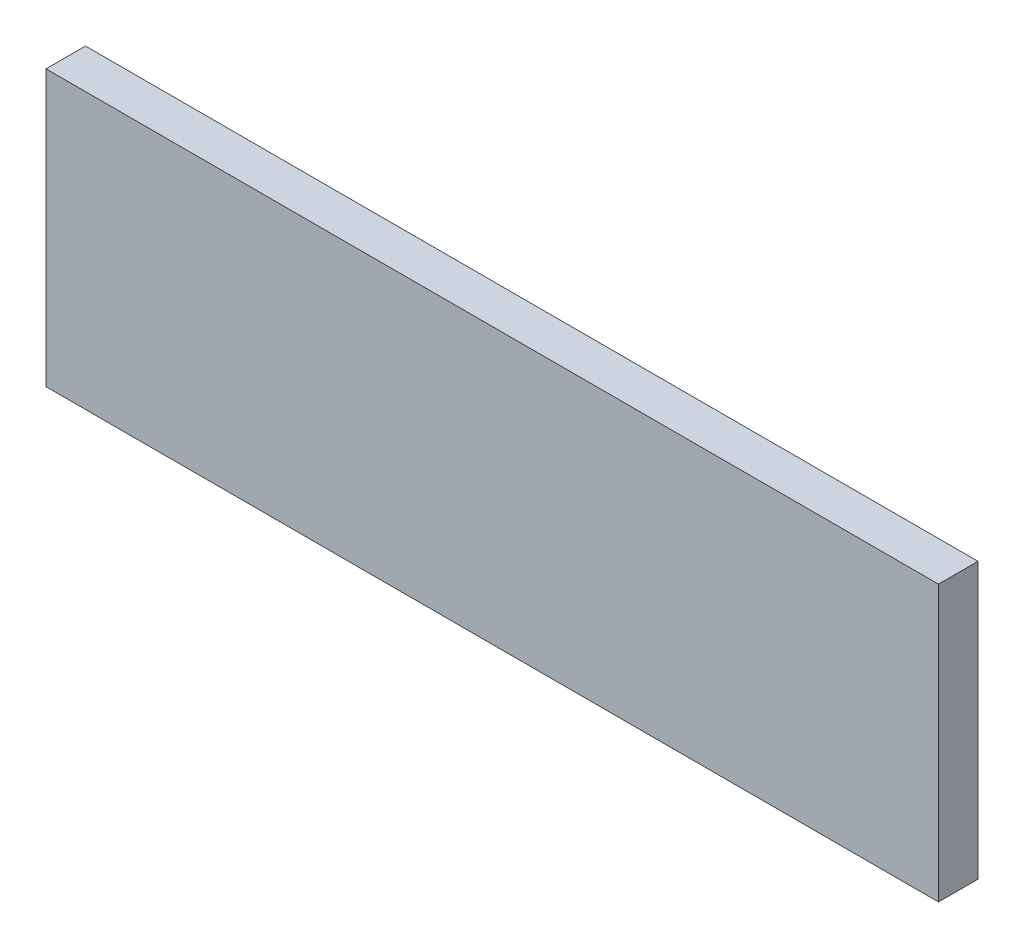
ISO-10303-21;
HEADER;
FILE_DESCRIPTION(('STEP AP214'),'2;1');
FILE_NAME('part.step','',(''),(''),'','','');
FILE_SCHEMA(('AUTOMOTIVE_DESIGN { 1 0 10303 214 1 1 1 1 }'));
ENDSEC;
DATA;
#1=APPLICATION_CONTEXT('core data for automotive mechanical design processes');
#2=APPLICATION_PROTOCOL_DEFINITION('international standard','automotive_design',2000,#1);
#3=PRODUCT_CONTEXT('',#1,'mechanical');
#4=PRODUCT('Part','Part','',(#3));
#5=PRODUCT_RELATED_PRODUCT_CATEGORY('part','',(#4));
#6=PRODUCT_DEFINITION_FORMATION('','',#4);
#7=PRODUCT_DEFINITION_CONTEXT('part definition',#1,'design');
#8=PRODUCT_DEFINITION('design','',#6,#7);
#9=PRODUCT_DEFINITION_SHAPE('','',#8);
#10=(LENGTH_UNIT() NAMED_UNIT(*) SI_UNIT(.MILLI.,.METRE.));
#11=(NAMED_UNIT(*) PLANE_ANGLE_UNIT() SI_UNIT($,.RADIAN.));
#12=(NAMED_UNIT(*) SI_UNIT($,.STERADIAN.) SOLID_ANGLE_UNIT());
#13=UNCERTAINTY_MEASURE_WITH_UNIT(LENGTH_MEASURE(1.E-05),#10,'distance_accuracy_value','');
#14=(GEOMETRIC_REPRESENTATION_CONTEXT(3) GLOBAL_UNCERTAINTY_ASSIGNED_CONTEXT((#13)) GLOBAL_UNIT_ASSIGNED_CONTEXT((#10,
#11,#12)) REPRESENTATION_CONTEXT('',''));
#15=CARTESIAN_POINT('',(0.,0.,0.));
#16=DIRECTION('',(0.,0.,1.));
#17=DIRECTION('',(1.,0.,0.));
#18=AXIS2_PLACEMENT_3D('',#15,#16,#17);
#19=CARTESIAN_POINT('',(137.8,42.5,12.2));
#20=DIRECTION('',(-1.,0.,0.));
#21=DIRECTION('',(0.,-1.,0.));
#22=AXIS2_PLACEMENT_3D('',#19,#20,#21);
#23=PLANE('',#22);
#24=DIRECTION('',(0.,1.,0.));
#25=VECTOR('',#24,1.);
#26=CARTESIAN_POINT('',(137.8,42.5,0.));
#27=LINE('',#26,#25);
#28=CARTESIAN_POINT('',(137.8,-42.5,0.));
#29=VERTEX_POINT('',#28);
#30=CARTESIAN_POINT('',(137.8,42.5,0.));
#31=VERTEX_POINT('',#30);
#32=EDGE_CURVE('E109',#29,#31,#27,.T.);
#33=ORIENTED_EDGE('',*,*,#32,.T.);
#34=DIRECTION('',(0.,0.,-1.));
#35=VECTOR('',#34,1.);
#36=CARTESIAN_POINT('',(137.8,42.5,12.2));
#37=LINE('',#36,#35);
#38=CARTESIAN_POINT('',(137.8,42.5,12.2));
#39=VERTEX_POINT('',#38);
#40=EDGE_CURVE('E11',#39,#31,#37,.T.);
#41=ORIENTED_EDGE('',*,*,#40,.F.);
#42=DIRECTION('',(0.,1.,0.));
#43=VECTOR('',#42,1.);
#44=CARTESIAN_POINT('',(137.8,42.5,12.2));
#45=LINE('',#44,#43);
#46=CARTESIAN_POINT('',(137.8,-42.5,12.2));
#47=VERTEX_POINT('',#46);
#48=EDGE_CURVE('E93',#47,#39,#45,.T.);
#49=ORIENTED_EDGE('',*,*,#48,.F.);
#50=DIRECTION('',(0.,0.,-1.));
#51=VECTOR('',#50,1.);
#52=CARTESIAN_POINT('',(137.8,-42.5,12.2));
#53=LINE('',#52,#51);
#54=EDGE_CURVE('E105',#47,#29,#53,.T.);
#55=ORIENTED_EDGE('',*,*,#54,.T.);
#56=EDGE_LOOP('',(#33,#41,#49,#55));
#57=FACE_BOUND('',#56,.T.);
#58=ADVANCED_FACE('F41',(#57),#23,.F.);
#59=CARTESIAN_POINT('',(-137.8,42.5,12.2));
#60=DIRECTION('',(0.,-1.,0.));
#61=DIRECTION('',(0.,0.,-1.));
#62=AXIS2_PLACEMENT_3D('',#59,#60,#61);
#63=PLANE('',#62);
#64=DIRECTION('',(-1.,0.,0.));
#65=VECTOR('',#64,1.);
#66=CARTESIAN_POINT('',(-137.8,42.5,0.));
#67=LINE('',#66,#65);
#68=CARTESIAN_POINT('',(-137.8,42.5,0.));
#69=VERTEX_POINT('',#68);
#70=EDGE_CURVE('E98',#31,#69,#67,.T.);
#71=ORIENTED_EDGE('',*,*,#70,.T.);
#72=DIRECTION('',(0.,0.,-1.));
#73=VECTOR('',#72,1.);
#74=CARTESIAN_POINT('',(-137.8,42.5,12.2));
#75=LINE('',#74,#73);
#76=CARTESIAN_POINT('',(-137.8,42.5,12.2));
#77=VERTEX_POINT('',#76);
#78=EDGE_CURVE('E50',#77,#69,#75,.T.);
#79=ORIENTED_EDGE('',*,*,#78,.F.);
#80=DIRECTION('',(-1.,0.,0.));
#81=VECTOR('',#80,1.);
#82=CARTESIAN_POINT('',(-137.8,42.5,12.2));
#83=LINE('',#82,#81);
#84=EDGE_CURVE('E88',#39,#77,#83,.T.);
#85=ORIENTED_EDGE('',*,*,#84,.F.);
#86=ORIENTED_EDGE('',*,*,#40,.T.);
#87=EDGE_LOOP('',(#71,#79,#85,#86));
#88=FACE_BOUND('',#87,.T.);
#89=ADVANCED_FACE('F97',(#88),#63,.F.);
#90=CARTESIAN_POINT('',(-137.8,42.5,12.2));
#91=DIRECTION('',(1.,0.,0.));
#92=DIRECTION('',(0.,1.,0.));
#93=AXIS2_PLACEMENT_3D('',#90,#91,#92);
#94=PLANE('',#93);
#95=DIRECTION('',(0.,-1.,0.));
#96=VECTOR('',#95,1.);
#97=CARTESIAN_POINT('',(-137.8,42.5,0.));
#98=LINE('',#97,#96);
#99=CARTESIAN_POINT('',(-137.8,-42.5,0.));
#100=VERTEX_POINT('',#99);
#101=EDGE_CURVE('E75',#69,#100,#98,.T.);
#102=ORIENTED_EDGE('',*,*,#101,.T.);
#103=DIRECTION('',(0.,0.,-1.));
#104=VECTOR('',#103,1.);
#105=CARTESIAN_POINT('',(-137.8,-42.5,12.2));
#106=LINE('',#105,#104);
#107=CARTESIAN_POINT('',(-137.8,-42.5,12.2));
#108=VERTEX_POINT('',#107);
#109=EDGE_CURVE('E100',#108,#100,#106,.T.);
#110=ORIENTED_EDGE('',*,*,#109,.F.);
#111=DIRECTION('',(0.,-1.,0.));
#112=VECTOR('',#111,1.);
#113=CARTESIAN_POINT('',(-137.8,42.5,12.2));
#114=LINE('',#113,#112);
#115=EDGE_CURVE('E91',#77,#108,#114,.T.);
#116=ORIENTED_EDGE('',*,*,#115,.F.);
#117=ORIENTED_EDGE('',*,*,#78,.T.);
#118=EDGE_LOOP('',(#102,#110,#116,#117));
#119=FACE_BOUND('',#118,.T.);
#120=ADVANCED_FACE('F101',(#119),#94,.F.);
#121=CARTESIAN_POINT('',(-137.8,-42.5,12.2));
#122=DIRECTION('',(0.,1.,0.));
#123=DIRECTION('',(0.,0.,1.));
#124=AXIS2_PLACEMENT_3D('',#121,#122,#123);
#125=PLANE('',#124);
#126=DIRECTION('',(1.,0.,0.));
#127=VECTOR('',#126,1.);
#128=CARTESIAN_POINT('',(-137.8,-42.5,0.));
#129=LINE('',#128,#127);
#130=EDGE_CURVE('E81',#100,#29,#129,.T.);
#131=ORIENTED_EDGE('',*,*,#130,.T.);
#132=ORIENTED_EDGE('',*,*,#54,.F.);
#133=DIRECTION('',(1.,0.,0.));
#134=VECTOR('',#133,1.);
#135=CARTESIAN_POINT('',(-137.8,-42.5,12.2));
#136=LINE('',#135,#134);
#137=EDGE_CURVE('E58',#108,#47,#136,.T.);
#138=ORIENTED_EDGE('',*,*,#137,.F.);
#139=ORIENTED_EDGE('',*,*,#109,.T.);
#140=EDGE_LOOP('',(#131,#132,#138,#139));
#141=FACE_BOUND('',#140,.T.);
#142=ADVANCED_FACE('F122',(#141),#125,.F.);
#143=CARTESIAN_POINT('',(0.,0.,12.2));
#144=DIRECTION('',(0.,0.,1.));
#145=DIRECTION('',(1.,0.,0.));
#146=AXIS2_PLACEMENT_3D('',#143,#144,#145);
#147=PLANE('',#146);
#148=ORIENTED_EDGE('',*,*,#48,.T.);
#149=ORIENTED_EDGE('',*,*,#84,.T.);
#150=ORIENTED_EDGE('',*,*,#115,.T.);
#151=ORIENTED_EDGE('',*,*,#137,.T.);
#152=EDGE_LOOP('',(#148,#149,#150,#151));
#153=FACE_BOUND('',#152,.T.);
#154=ADVANCED_FACE('F89',(#153),#147,.T.);
#155=CARTESIAN_POINT('',(0.,0.,0.));
#156=DIRECTION('',(0.,0.,1.));
#157=DIRECTION('',(1.,0.,0.));
#158=AXIS2_PLACEMENT_3D('',#155,#156,#157);
#159=PLANE('',#158);
#160=ORIENTED_EDGE('',*,*,#32,.F.);
#161=ORIENTED_EDGE('',*,*,#130,.F.);
#162=ORIENTED_EDGE('',*,*,#101,.F.);
#163=ORIENTED_EDGE('',*,*,#70,.F.);
#164=EDGE_LOOP('',(#160,#161,#162,#163));
#165=FACE_BOUND('',#164,.T.);
#166=ADVANCED_FACE('F125',(#165),#159,.F.);
#167=CLOSED_SHELL('',(#58,#89,#120,#142,#154,#166));
#168=MANIFOLD_SOLID_BREP('B2',#167);
#169=ADVANCED_BREP_SHAPE_REPRESENTATION('',(#18,#168),#14);
#170=SHAPE_DEFINITION_REPRESENTATION(#9,#169);
ENDSEC;
END-ISO-10303-21;
